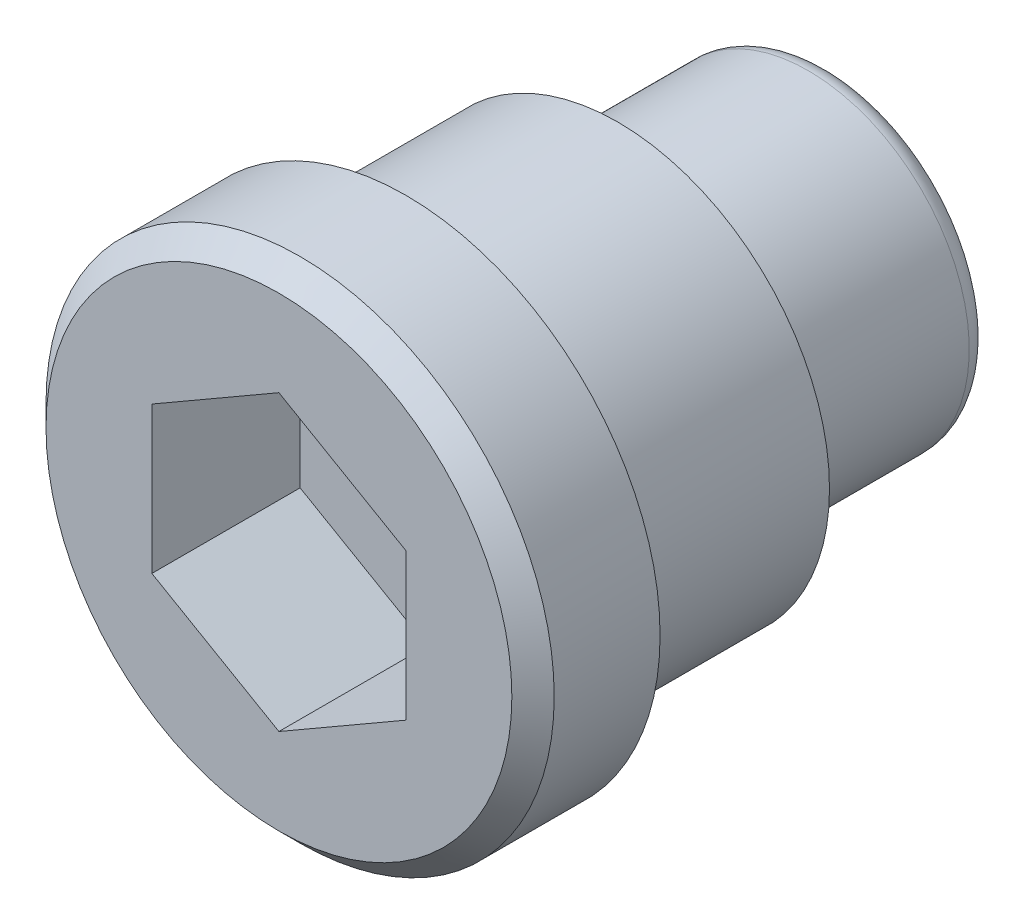
ISO-10303-21;
HEADER;
FILE_DESCRIPTION(('STEP AP214'),'2;1');
FILE_NAME('part.step','',(''),(''),'','','');
FILE_SCHEMA(('AUTOMOTIVE_DESIGN { 1 0 10303 214 1 1 1 1 }'));
ENDSEC;
DATA;
#1=APPLICATION_CONTEXT('core data for automotive mechanical design processes');
#2=APPLICATION_PROTOCOL_DEFINITION('international standard','automotive_design',2000,#1);
#3=PRODUCT_CONTEXT('',#1,'mechanical');
#4=PRODUCT('Part','Part','',(#3));
#5=PRODUCT_RELATED_PRODUCT_CATEGORY('part','',(#4));
#6=PRODUCT_DEFINITION_FORMATION('','',#4);
#7=PRODUCT_DEFINITION_CONTEXT('part definition',#1,'design');
#8=PRODUCT_DEFINITION('design','',#6,#7);
#9=PRODUCT_DEFINITION_SHAPE('','',#8);
#10=(LENGTH_UNIT() NAMED_UNIT(*) SI_UNIT(.MILLI.,.METRE.));
#11=(NAMED_UNIT(*) PLANE_ANGLE_UNIT() SI_UNIT($,.RADIAN.));
#12=(NAMED_UNIT(*) SI_UNIT($,.STERADIAN.) SOLID_ANGLE_UNIT());
#13=UNCERTAINTY_MEASURE_WITH_UNIT(LENGTH_MEASURE(1.E-05),#10,'distance_accuracy_value','');
#14=(GEOMETRIC_REPRESENTATION_CONTEXT(3) GLOBAL_UNCERTAINTY_ASSIGNED_CONTEXT((#13)) GLOBAL_UNIT_ASSIGNED_CONTEXT((#10,
#11,#12)) REPRESENTATION_CONTEXT('',''));
#15=CARTESIAN_POINT('',(0.,0.,0.));
#16=DIRECTION('',(0.,0.,1.));
#17=DIRECTION('',(1.,0.,0.));
#18=AXIS2_PLACEMENT_3D('',#15,#16,#17);
#19=CARTESIAN_POINT('',(0.,0.,-0.500000000001276));
#20=DIRECTION('',(0.,0.,-1.));
#21=DIRECTION('',(-1.,0.,0.));
#22=AXIS2_PLACEMENT_3D('',#19,#20,#21);
#23=CONICAL_SURFACE('',#22,6.,0.785398163397449);
#24=CARTESIAN_POINT('',(0.,0.,0.));
#25=DIRECTION('',(0.,0.,-1.));
#26=DIRECTION('',(-1.,0.,0.));
#27=AXIS2_PLACEMENT_3D('',#24,#25,#26);
#28=CIRCLE('',#27,5.49999999999872);
#29=CARTESIAN_POINT('',(-5.49999999999872,0.,0.));
#30=VERTEX_POINT('',#29);
#31=EDGE_CURVE('E182',#30,#30,#28,.T.);
#32=ORIENTED_EDGE('',*,*,#31,.T.);
#33=EDGE_LOOP('',(#32));
#34=FACE_BOUND('',#33,.T.);
#35=CARTESIAN_POINT('',(0.,0.,-0.500000000001276));
#36=DIRECTION('',(0.,0.,-1.));
#37=DIRECTION('',(-1.,0.,0.));
#38=AXIS2_PLACEMENT_3D('',#35,#36,#37);
#39=CIRCLE('',#38,6.);
#40=CARTESIAN_POINT('',(-6.,0.,-0.500000000001276));
#41=VERTEX_POINT('',#40);
#42=EDGE_CURVE('E178',#41,#41,#39,.T.);
#43=ORIENTED_EDGE('',*,*,#42,.F.);
#44=EDGE_LOOP('',(#43));
#45=FACE_BOUND('',#44,.T.);
#46=ADVANCED_FACE('F45',(#34,#45),#23,.T.);
#47=CARTESIAN_POINT('',(5.49999999999872,0.,0.));
#48=DIRECTION('',(0.,0.,1.));
#49=DIRECTION('',(1.,0.,0.));
#50=AXIS2_PLACEMENT_3D('',#47,#48,#49);
#51=PLANE('',#50);
#52=DIRECTION('',(0.,1.,0.));
#53=VECTOR('',#52,1.);
#54=CARTESIAN_POINT('',(3.,-1.73205080756888,0.));
#55=LINE('',#54,#53);
#56=CARTESIAN_POINT('',(3.,-1.73205080756888,0.));
#57=VERTEX_POINT('',#56);
#58=CARTESIAN_POINT('',(3.,1.73205080756888,0.));
#59=VERTEX_POINT('',#58);
#60=EDGE_CURVE('E61',#57,#59,#55,.T.);
#61=ORIENTED_EDGE('',*,*,#60,.F.);
#62=DIRECTION('',(0.866025403784439,0.499999999999999,0.));
#63=VECTOR('',#62,1.);
#64=CARTESIAN_POINT('',(0.,-3.46410161513775,0.));
#65=LINE('',#64,#63);
#66=CARTESIAN_POINT('',(0.,-3.46410161513775,0.));
#67=VERTEX_POINT('',#66);
#68=EDGE_CURVE('E154',#67,#57,#65,.T.);
#69=ORIENTED_EDGE('',*,*,#68,.F.);
#70=DIRECTION('',(0.86602540378444,-0.499999999999998,0.));
#71=VECTOR('',#70,1.);
#72=CARTESIAN_POINT('',(-3.,-1.73205080756888,0.));
#73=LINE('',#72,#71);
#74=CARTESIAN_POINT('',(-3.,-1.73205080756888,0.));
#75=VERTEX_POINT('',#74);
#76=EDGE_CURVE('E151',#75,#67,#73,.T.);
#77=ORIENTED_EDGE('',*,*,#76,.F.);
#78=DIRECTION('',(0.,-1.,0.));
#79=VECTOR('',#78,1.);
#80=CARTESIAN_POINT('',(-3.,1.73205080756888,0.));
#81=LINE('',#80,#79);
#82=CARTESIAN_POINT('',(-3.,1.73205080756888,0.));
#83=VERTEX_POINT('',#82);
#84=EDGE_CURVE('E109',#83,#75,#81,.T.);
#85=ORIENTED_EDGE('',*,*,#84,.F.);
#86=DIRECTION('',(-0.86602540378444,-0.499999999999998,0.));
#87=VECTOR('',#86,1.);
#88=CARTESIAN_POINT('',(0.,3.46410161513775,0.));
#89=LINE('',#88,#87);
#90=CARTESIAN_POINT('',(0.,3.46410161513775,0.));
#91=VERTEX_POINT('',#90);
#92=EDGE_CURVE('E145',#91,#83,#89,.T.);
#93=ORIENTED_EDGE('',*,*,#92,.F.);
#94=DIRECTION('',(-0.866025403784439,0.499999999999999,0.));
#95=VECTOR('',#94,1.);
#96=CARTESIAN_POINT('',(3.,1.73205080756888,0.));
#97=LINE('',#96,#95);
#98=EDGE_CURVE('E141',#59,#91,#97,.T.);
#99=ORIENTED_EDGE('',*,*,#98,.F.);
#100=EDGE_LOOP('',(#61,#69,#77,#85,#93,#99));
#101=FACE_BOUND('',#100,.T.);
#102=ORIENTED_EDGE('',*,*,#31,.F.);
#103=EDGE_LOOP('',(#102));
#104=FACE_BOUND('',#103,.T.);
#105=ADVANCED_FACE('F208',(#101,#104),#51,.T.);
#106=CARTESIAN_POINT('',(0.,0.,-3.));
#107=DIRECTION('',(0.,0.,-1.));
#108=DIRECTION('',(-1.,0.,0.));
#109=AXIS2_PLACEMENT_3D('',#106,#107,#108);
#110=PLANE('',#109);
#111=CARTESIAN_POINT('',(0.,0.,-3.));
#112=DIRECTION('',(0.,0.,-1.));
#113=DIRECTION('',(-1.,0.,0.));
#114=AXIS2_PLACEMENT_3D('',#111,#112,#113);
#115=CIRCLE('',#114,5.);
#116=CARTESIAN_POINT('',(-5.,0.,-3.));
#117=VERTEX_POINT('',#116);
#118=EDGE_CURVE('E174',#117,#117,#115,.T.);
#119=ORIENTED_EDGE('',*,*,#118,.F.);
#120=EDGE_LOOP('',(#119));
#121=FACE_BOUND('',#120,.T.);
#122=CARTESIAN_POINT('',(0.,0.,-3.));
#123=DIRECTION('',(0.,0.,-1.));
#124=DIRECTION('',(-1.,0.,0.));
#125=AXIS2_PLACEMENT_3D('',#122,#123,#124);
#126=CIRCLE('',#125,6.);
#127=CARTESIAN_POINT('',(-6.,0.,-3.));
#128=VERTEX_POINT('',#127);
#129=EDGE_CURVE('E186',#128,#128,#126,.T.);
#130=ORIENTED_EDGE('',*,*,#129,.T.);
#131=EDGE_LOOP('',(#130));
#132=FACE_BOUND('',#131,.T.);
#133=ADVANCED_FACE('F214',(#121,#132),#110,.T.);
#134=CARTESIAN_POINT('',(0.,0.,0.));
#135=DIRECTION('',(0.,0.,-1.));
#136=DIRECTION('',(-1.,0.,0.));
#137=AXIS2_PLACEMENT_3D('',#134,#135,#136);
#138=CYLINDRICAL_SURFACE('',#137,6.);
#139=ORIENTED_EDGE('',*,*,#42,.T.);
#140=EDGE_LOOP('',(#139));
#141=FACE_BOUND('',#140,.T.);
#142=ORIENTED_EDGE('',*,*,#129,.F.);
#143=EDGE_LOOP('',(#142));
#144=FACE_BOUND('',#143,.T.);
#145=ADVANCED_FACE('F221',(#141,#144),#138,.T.);
#146=CARTESIAN_POINT('',(0.,0.,-8.));
#147=DIRECTION('',(0.,0.,1.));
#148=DIRECTION('',(1.,0.,0.));
#149=AXIS2_PLACEMENT_3D('',#146,#147,#148);
#150=CYLINDRICAL_SURFACE('',#149,5.);
#151=CARTESIAN_POINT('',(0.,0.,-8.));
#152=DIRECTION('',(0.,0.,-1.));
#153=DIRECTION('',(-1.,0.,0.));
#154=AXIS2_PLACEMENT_3D('',#151,#152,#153);
#155=CIRCLE('',#154,5.);
#156=CARTESIAN_POINT('',(-5.,0.,-8.));
#157=VERTEX_POINT('',#156);
#158=EDGE_CURVE('E160',#157,#157,#155,.T.);
#159=ORIENTED_EDGE('',*,*,#158,.F.);
#160=EDGE_LOOP('',(#159));
#161=FACE_BOUND('',#160,.T.);
#162=ORIENTED_EDGE('',*,*,#118,.T.);
#163=EDGE_LOOP('',(#162));
#164=FACE_BOUND('',#163,.T.);
#165=ADVANCED_FACE('F224',(#161,#164),#150,.T.);
#166=CARTESIAN_POINT('',(0.,0.,-8.));
#167=DIRECTION('',(0.,0.,-1.));
#168=DIRECTION('',(-1.,0.,0.));
#169=AXIS2_PLACEMENT_3D('',#166,#167,#168);
#170=PLANE('',#169);
#171=CARTESIAN_POINT('',(0.,0.,-8.));
#172=DIRECTION('',(0.,0.,-1.));
#173=DIRECTION('',(-1.,0.,0.));
#174=AXIS2_PLACEMENT_3D('',#171,#172,#173);
#175=CIRCLE('',#174,3.8);
#176=CARTESIAN_POINT('',(-3.8,0.,-8.));
#177=VERTEX_POINT('',#176);
#178=EDGE_CURVE('E170',#177,#177,#175,.T.);
#179=ORIENTED_EDGE('',*,*,#178,.F.);
#180=EDGE_LOOP('',(#179));
#181=FACE_BOUND('',#180,.T.);
#182=ORIENTED_EDGE('',*,*,#158,.T.);
#183=EDGE_LOOP('',(#182));
#184=FACE_BOUND('',#183,.T.);
#185=ADVANCED_FACE('F228',(#181,#184),#170,.T.);
#186=CARTESIAN_POINT('',(0.,0.,-13.));
#187=DIRECTION('',(0.,0.,1.));
#188=DIRECTION('',(1.,0.,0.));
#189=AXIS2_PLACEMENT_3D('',#186,#187,#188);
#190=CYLINDRICAL_SURFACE('',#189,3.8);
#191=CARTESIAN_POINT('',(0.,0.,-12.5));
#192=DIRECTION('',(0.,0.,-1.));
#193=DIRECTION('',(-1.,0.,0.));
#194=AXIS2_PLACEMENT_3D('',#191,#192,#193);
#195=CIRCLE('',#194,3.8);
#196=CARTESIAN_POINT('',(-3.8,0.,-12.5));
#197=VERTEX_POINT('',#196);
#198=EDGE_CURVE('E11',#197,#197,#195,.F.);
#199=ORIENTED_EDGE('',*,*,#198,.T.);
#200=EDGE_LOOP('',(#199));
#201=FACE_BOUND('',#200,.T.);
#202=ORIENTED_EDGE('',*,*,#178,.T.);
#203=EDGE_LOOP('',(#202));
#204=FACE_BOUND('',#203,.T.);
#205=ADVANCED_FACE('F232',(#201,#204),#190,.T.);
#206=CARTESIAN_POINT('',(0.,0.,-13.));
#207=DIRECTION('',(0.,0.,-1.));
#208=DIRECTION('',(-1.,0.,0.));
#209=AXIS2_PLACEMENT_3D('',#206,#207,#208);
#210=PLANE('',#209);
#211=CARTESIAN_POINT('',(0.,0.,-13.));
#212=DIRECTION('',(0.,0.,-1.));
#213=DIRECTION('',(-1.,0.,0.));
#214=AXIS2_PLACEMENT_3D('',#211,#212,#213);
#215=CIRCLE('',#214,3.3);
#216=CARTESIAN_POINT('',(-3.3,0.,-13.));
#217=VERTEX_POINT('',#216);
#218=EDGE_CURVE('E54',#217,#217,#215,.T.);
#219=ORIENTED_EDGE('',*,*,#218,.T.);
#220=EDGE_LOOP('',(#219));
#221=FACE_BOUND('',#220,.T.);
#222=ADVANCED_FACE('F196',(#221),#210,.T.);
#223=CARTESIAN_POINT('',(3.,-1.73205080756888,-3.5));
#224=DIRECTION('',(1.,0.,0.));
#225=DIRECTION('',(0.,0.,-1.));
#226=AXIS2_PLACEMENT_3D('',#223,#224,#225);
#227=PLANE('',#226);
#228=ORIENTED_EDGE('',*,*,#60,.T.);
#229=DIRECTION('',(0.,0.,1.));
#230=VECTOR('',#229,1.);
#231=CARTESIAN_POINT('',(3.,1.73205080756888,-3.5));
#232=LINE('',#231,#230);
#233=CARTESIAN_POINT('',(3.,1.73205080756888,-3.5));
#234=VERTEX_POINT('',#233);
#235=EDGE_CURVE('E91',#234,#59,#232,.T.);
#236=ORIENTED_EDGE('',*,*,#235,.F.);
#237=DIRECTION('',(0.,1.,0.));
#238=VECTOR('',#237,1.);
#239=CARTESIAN_POINT('',(3.,-1.73205080756888,-3.5));
#240=LINE('',#239,#238);
#241=CARTESIAN_POINT('',(3.,-1.73205080756888,-3.5));
#242=VERTEX_POINT('',#241);
#243=EDGE_CURVE('E157',#242,#234,#240,.T.);
#244=ORIENTED_EDGE('',*,*,#243,.F.);
#245=DIRECTION('',(0.,0.,1.));
#246=VECTOR('',#245,1.);
#247=CARTESIAN_POINT('',(3.,-1.73205080756888,-3.5));
#248=LINE('',#247,#246);
#249=EDGE_CURVE('E69',#242,#57,#248,.T.);
#250=ORIENTED_EDGE('',*,*,#249,.T.);
#251=EDGE_LOOP('',(#228,#236,#244,#250));
#252=FACE_BOUND('',#251,.T.);
#253=ADVANCED_FACE('F238',(#252),#227,.F.);
#254=CARTESIAN_POINT('',(0.,-3.46410161513775,-3.5));
#255=DIRECTION('',(0.499999999999999,-0.866025403784439,0.));
#256=DIRECTION('',(0.866025403784439,0.499999999999999,0.));
#257=AXIS2_PLACEMENT_3D('',#254,#255,#256);
#258=PLANE('',#257);
#259=ORIENTED_EDGE('',*,*,#68,.T.);
#260=ORIENTED_EDGE('',*,*,#249,.F.);
#261=DIRECTION('',(0.866025403784439,0.499999999999999,0.));
#262=VECTOR('',#261,1.);
#263=CARTESIAN_POINT('',(0.,-3.46410161513775,-3.5));
#264=LINE('',#263,#262);
#265=CARTESIAN_POINT('',(0.,-3.46410161513775,-3.5));
#266=VERTEX_POINT('',#265);
#267=EDGE_CURVE('E123',#266,#242,#264,.T.);
#268=ORIENTED_EDGE('',*,*,#267,.F.);
#269=DIRECTION('',(0.,0.,1.));
#270=VECTOR('',#269,1.);
#271=CARTESIAN_POINT('',(0.,-3.46410161513775,-3.5));
#272=LINE('',#271,#270);
#273=EDGE_CURVE('E114',#266,#67,#272,.T.);
#274=ORIENTED_EDGE('',*,*,#273,.T.);
#275=EDGE_LOOP('',(#259,#260,#268,#274));
#276=FACE_BOUND('',#275,.T.);
#277=ADVANCED_FACE('F241',(#276),#258,.F.);
#278=CARTESIAN_POINT('',(-3.,-1.73205080756888,-3.5));
#279=DIRECTION('',(-0.499999999999998,-0.86602540378444,0.));
#280=DIRECTION('',(0.86602540378444,-0.499999999999998,0.));
#281=AXIS2_PLACEMENT_3D('',#278,#279,#280);
#282=PLANE('',#281);
#283=ORIENTED_EDGE('',*,*,#76,.T.);
#284=ORIENTED_EDGE('',*,*,#273,.F.);
#285=DIRECTION('',(0.86602540378444,-0.499999999999998,0.));
#286=VECTOR('',#285,1.);
#287=CARTESIAN_POINT('',(-3.,-1.73205080756888,-3.5));
#288=LINE('',#287,#286);
#289=CARTESIAN_POINT('',(-3.,-1.73205080756888,-3.5));
#290=VERTEX_POINT('',#289);
#291=EDGE_CURVE('E118',#290,#266,#288,.T.);
#292=ORIENTED_EDGE('',*,*,#291,.F.);
#293=DIRECTION('',(0.,0.,1.));
#294=VECTOR('',#293,1.);
#295=CARTESIAN_POINT('',(-3.,-1.73205080756888,-3.5));
#296=LINE('',#295,#294);
#297=EDGE_CURVE('E102',#290,#75,#296,.T.);
#298=ORIENTED_EDGE('',*,*,#297,.T.);
#299=EDGE_LOOP('',(#283,#284,#292,#298));
#300=FACE_BOUND('',#299,.T.);
#301=ADVANCED_FACE('F119',(#300),#282,.F.);
#302=CARTESIAN_POINT('',(-3.,1.73205080756888,-3.5));
#303=DIRECTION('',(-1.,0.,0.));
#304=DIRECTION('',(0.,0.,1.));
#305=AXIS2_PLACEMENT_3D('',#302,#303,#304);
#306=PLANE('',#305);
#307=ORIENTED_EDGE('',*,*,#84,.T.);
#308=ORIENTED_EDGE('',*,*,#297,.F.);
#309=DIRECTION('',(0.,-1.,0.));
#310=VECTOR('',#309,1.);
#311=CARTESIAN_POINT('',(-3.,1.73205080756888,-3.5));
#312=LINE('',#311,#310);
#313=CARTESIAN_POINT('',(-3.,1.73205080756888,-3.5));
#314=VERTEX_POINT('',#313);
#315=EDGE_CURVE('E106',#314,#290,#312,.T.);
#316=ORIENTED_EDGE('',*,*,#315,.F.);
#317=DIRECTION('',(0.,0.,1.));
#318=VECTOR('',#317,1.);
#319=CARTESIAN_POINT('',(-3.,1.73205080756888,-3.5));
#320=LINE('',#319,#318);
#321=EDGE_CURVE('E115',#314,#83,#320,.T.);
#322=ORIENTED_EDGE('',*,*,#321,.T.);
#323=EDGE_LOOP('',(#307,#308,#316,#322));
#324=FACE_BOUND('',#323,.T.);
#325=ADVANCED_FACE('F104',(#324),#306,.F.);
#326=CARTESIAN_POINT('',(0.,3.46410161513775,-3.5));
#327=DIRECTION('',(-0.499999999999998,0.86602540378444,0.));
#328=DIRECTION('',(-0.86602540378444,-0.499999999999998,0.));
#329=AXIS2_PLACEMENT_3D('',#326,#327,#328);
#330=PLANE('',#329);
#331=ORIENTED_EDGE('',*,*,#92,.T.);
#332=ORIENTED_EDGE('',*,*,#321,.F.);
#333=DIRECTION('',(-0.86602540378444,-0.499999999999998,0.));
#334=VECTOR('',#333,1.);
#335=CARTESIAN_POINT('',(0.,3.46410161513775,-3.5));
#336=LINE('',#335,#334);
#337=CARTESIAN_POINT('',(0.,3.46410161513775,-3.5));
#338=VERTEX_POINT('',#337);
#339=EDGE_CURVE('E129',#338,#314,#336,.T.);
#340=ORIENTED_EDGE('',*,*,#339,.F.);
#341=DIRECTION('',(0.,0.,1.));
#342=VECTOR('',#341,1.);
#343=CARTESIAN_POINT('',(0.,3.46410161513775,-3.5));
#344=LINE('',#343,#342);
#345=EDGE_CURVE('E165',#338,#91,#344,.T.);
#346=ORIENTED_EDGE('',*,*,#345,.T.);
#347=EDGE_LOOP('',(#331,#332,#340,#346));
#348=FACE_BOUND('',#347,.T.);
#349=ADVANCED_FACE('F244',(#348),#330,.F.);
#350=CARTESIAN_POINT('',(3.,1.73205080756888,-3.5));
#351=DIRECTION('',(0.499999999999999,0.866025403784439,0.));
#352=DIRECTION('',(-0.866025403784439,0.499999999999999,0.));
#353=AXIS2_PLACEMENT_3D('',#350,#351,#352);
#354=PLANE('',#353);
#355=ORIENTED_EDGE('',*,*,#98,.T.);
#356=ORIENTED_EDGE('',*,*,#345,.F.);
#357=DIRECTION('',(-0.866025403784439,0.499999999999999,0.));
#358=VECTOR('',#357,1.);
#359=CARTESIAN_POINT('',(3.,1.73205080756888,-3.5));
#360=LINE('',#359,#358);
#361=EDGE_CURVE('E133',#234,#338,#360,.T.);
#362=ORIENTED_EDGE('',*,*,#361,.F.);
#363=ORIENTED_EDGE('',*,*,#235,.T.);
#364=EDGE_LOOP('',(#355,#356,#362,#363));
#365=FACE_BOUND('',#364,.T.);
#366=ADVANCED_FACE('F204',(#365),#354,.F.);
#367=CARTESIAN_POINT('',(0.,0.,-3.5));
#368=DIRECTION('',(0.,0.,1.));
#369=DIRECTION('',(1.,0.,0.));
#370=AXIS2_PLACEMENT_3D('',#367,#368,#369);
#371=PLANE('',#370);
#372=ORIENTED_EDGE('',*,*,#243,.T.);
#373=ORIENTED_EDGE('',*,*,#361,.T.);
#374=ORIENTED_EDGE('',*,*,#339,.T.);
#375=ORIENTED_EDGE('',*,*,#315,.T.);
#376=ORIENTED_EDGE('',*,*,#291,.T.);
#377=ORIENTED_EDGE('',*,*,#267,.T.);
#378=EDGE_LOOP('',(#372,#373,#374,#375,#376,#377));
#379=FACE_BOUND('',#378,.T.);
#380=ADVANCED_FACE('F126',(#379),#371,.T.);
#381=CARTESIAN_POINT('',(0.,0.,-12.5));
#382=DIRECTION('',(0.,0.,-1.));
#383=DIRECTION('',(-1.,0.,0.));
#384=AXIS2_PLACEMENT_3D('',#381,#382,#383);
#385=TOROIDAL_SURFACE('',#384,3.3,0.5);
#386=ORIENTED_EDGE('',*,*,#198,.F.);
#387=EDGE_LOOP('',(#386));
#388=FACE_BOUND('',#387,.T.);
#389=ORIENTED_EDGE('',*,*,#218,.F.);
#390=EDGE_LOOP('',(#389));
#391=FACE_BOUND('',#390,.T.);
#392=ADVANCED_FACE('F47',(#388,#391),#385,.T.);
#393=CLOSED_SHELL('',(#46,#105,#133,#145,#165,#185,#205,#222,#253,#277,#301,#325,#349,#366,#380,#392));
#394=MANIFOLD_SOLID_BREP('B2',#393);
#395=ADVANCED_BREP_SHAPE_REPRESENTATION('',(#18,#394),#14);
#396=SHAPE_DEFINITION_REPRESENTATION(#9,#395);
ENDSEC;
END-ISO-10303-21;
